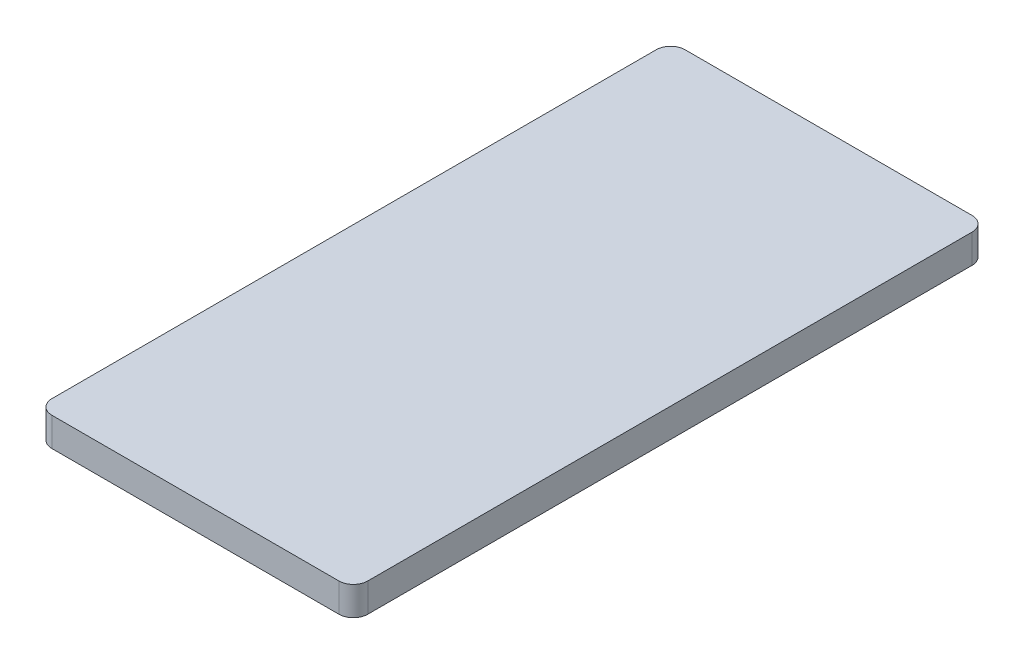
ISO-10303-21;
HEADER;
FILE_DESCRIPTION(('STEP AP214'),'2;1');
FILE_NAME('part.step','',(''),(''),'','','');
FILE_SCHEMA(('AUTOMOTIVE_DESIGN { 1 0 10303 214 1 1 1 1 }'));
ENDSEC;
DATA;
#1=APPLICATION_CONTEXT('core data for automotive mechanical design processes');
#2=APPLICATION_PROTOCOL_DEFINITION('international standard','automotive_design',2000,#1);
#3=PRODUCT_CONTEXT('',#1,'mechanical');
#4=PRODUCT('Part','Part','',(#3));
#5=PRODUCT_RELATED_PRODUCT_CATEGORY('part','',(#4));
#6=PRODUCT_DEFINITION_FORMATION('','',#4);
#7=PRODUCT_DEFINITION_CONTEXT('part definition',#1,'design');
#8=PRODUCT_DEFINITION('design','',#6,#7);
#9=PRODUCT_DEFINITION_SHAPE('','',#8);
#10=(LENGTH_UNIT() NAMED_UNIT(*) SI_UNIT(.MILLI.,.METRE.));
#11=(NAMED_UNIT(*) PLANE_ANGLE_UNIT() SI_UNIT($,.RADIAN.));
#12=(NAMED_UNIT(*) SI_UNIT($,.STERADIAN.) SOLID_ANGLE_UNIT());
#13=UNCERTAINTY_MEASURE_WITH_UNIT(LENGTH_MEASURE(1.E-05),#10,'distance_accuracy_value','');
#14=(GEOMETRIC_REPRESENTATION_CONTEXT(3) GLOBAL_UNCERTAINTY_ASSIGNED_CONTEXT((#13)) GLOBAL_UNIT_ASSIGNED_CONTEXT((#10,
#11,#12)) REPRESENTATION_CONTEXT('',''));
#15=CARTESIAN_POINT('',(0.,0.,0.));
#16=DIRECTION('',(0.,0.,1.));
#17=DIRECTION('',(1.,0.,0.));
#18=AXIS2_PLACEMENT_3D('',#15,#16,#17);
#19=CARTESIAN_POINT('',(-12.6365,2.54,26.6065));
#20=DIRECTION('',(0.,-1.,0.));
#21=DIRECTION('',(0.,0.,-1.));
#22=AXIS2_PLACEMENT_3D('',#19,#20,#21);
#23=CYLINDRICAL_SURFACE('',#22,1.27);
#24=CARTESIAN_POINT('',(-12.6365,0.,26.6065));
#25=DIRECTION('',(0.,1.,0.));
#26=DIRECTION('',(0.,0.,-1.));
#27=AXIS2_PLACEMENT_3D('',#24,#25,#26);
#28=CIRCLE('',#27,1.27);
#29=CARTESIAN_POINT('',(-13.9065,0.,26.6065));
#30=VERTEX_POINT('',#29);
#31=CARTESIAN_POINT('',(-12.6365,0.,27.8765));
#32=VERTEX_POINT('',#31);
#33=EDGE_CURVE('E139',#30,#32,#28,.T.);
#34=ORIENTED_EDGE('',*,*,#33,.T.);
#35=DIRECTION('',(0.,-1.,0.));
#36=VECTOR('',#35,1.);
#37=CARTESIAN_POINT('',(-12.6365,2.54,27.8765));
#38=LINE('',#37,#36);
#39=CARTESIAN_POINT('',(-12.6365,2.54,27.8765));
#40=VERTEX_POINT('',#39);
#41=EDGE_CURVE('E11',#40,#32,#38,.T.);
#42=ORIENTED_EDGE('',*,*,#41,.F.);
#43=CARTESIAN_POINT('',(-12.6365,2.54,26.6065));
#44=DIRECTION('',(0.,1.,0.));
#45=DIRECTION('',(0.,0.,-1.));
#46=AXIS2_PLACEMENT_3D('',#43,#44,#45);
#47=CIRCLE('',#46,1.27);
#48=CARTESIAN_POINT('',(-13.9065,2.54,26.6065));
#49=VERTEX_POINT('',#48);
#50=EDGE_CURVE('E153',#49,#40,#47,.T.);
#51=ORIENTED_EDGE('',*,*,#50,.F.);
#52=DIRECTION('',(0.,-1.,0.));
#53=VECTOR('',#52,1.);
#54=CARTESIAN_POINT('',(-13.9065,2.54,26.6065));
#55=LINE('',#54,#53);
#56=EDGE_CURVE('E135',#49,#30,#55,.T.);
#57=ORIENTED_EDGE('',*,*,#56,.T.);
#58=EDGE_LOOP('',(#34,#42,#51,#57));
#59=FACE_BOUND('',#58,.T.);
#60=ADVANCED_FACE('F43',(#59),#23,.T.);
#61=CARTESIAN_POINT('',(-12.6365,2.54,27.8765));
#62=DIRECTION('',(0.,0.,-1.));
#63=DIRECTION('',(-1.,0.,0.));
#64=AXIS2_PLACEMENT_3D('',#61,#62,#63);
#65=PLANE('',#64);
#66=DIRECTION('',(1.,0.,0.));
#67=VECTOR('',#66,1.);
#68=CARTESIAN_POINT('',(-12.6365,0.,27.8765));
#69=LINE('',#68,#67);
#70=CARTESIAN_POINT('',(12.6365,0.,27.8765));
#71=VERTEX_POINT('',#70);
#72=EDGE_CURVE('E142',#32,#71,#69,.T.);
#73=ORIENTED_EDGE('',*,*,#72,.T.);
#74=DIRECTION('',(0.,-1.,0.));
#75=VECTOR('',#74,1.);
#76=CARTESIAN_POINT('',(12.6365,2.54,27.8765));
#77=LINE('',#76,#75);
#78=CARTESIAN_POINT('',(12.6365,2.54,27.8765));
#79=VERTEX_POINT('',#78);
#80=EDGE_CURVE('E51',#79,#71,#77,.T.);
#81=ORIENTED_EDGE('',*,*,#80,.F.);
#82=DIRECTION('',(1.,0.,0.));
#83=VECTOR('',#82,1.);
#84=CARTESIAN_POINT('',(-12.6365,2.54,27.8765));
#85=LINE('',#84,#83);
#86=EDGE_CURVE('E102',#40,#79,#85,.T.);
#87=ORIENTED_EDGE('',*,*,#86,.F.);
#88=ORIENTED_EDGE('',*,*,#41,.T.);
#89=EDGE_LOOP('',(#73,#81,#87,#88));
#90=FACE_BOUND('',#89,.T.);
#91=ADVANCED_FACE('F188',(#90),#65,.F.);
#92=CARTESIAN_POINT('',(12.6365,2.54,26.6065));
#93=DIRECTION('',(0.,-1.,0.));
#94=DIRECTION('',(0.,0.,-1.));
#95=AXIS2_PLACEMENT_3D('',#92,#93,#94);
#96=CYLINDRICAL_SURFACE('',#95,1.27);
#97=CARTESIAN_POINT('',(12.6365,0.,26.6065));
#98=DIRECTION('',(0.,1.,0.));
#99=DIRECTION('',(0.,0.,1.));
#100=AXIS2_PLACEMENT_3D('',#97,#98,#99);
#101=CIRCLE('',#100,1.27);
#102=CARTESIAN_POINT('',(13.9065,0.,26.6065));
#103=VERTEX_POINT('',#102);
#104=EDGE_CURVE('E144',#71,#103,#101,.T.);
#105=ORIENTED_EDGE('',*,*,#104,.T.);
#106=DIRECTION('',(0.,-1.,0.));
#107=VECTOR('',#106,1.);
#108=CARTESIAN_POINT('',(13.9065,2.54,26.6065));
#109=LINE('',#108,#107);
#110=CARTESIAN_POINT('',(13.9065,2.54,26.6065));
#111=VERTEX_POINT('',#110);
#112=EDGE_CURVE('E160',#111,#103,#109,.T.);
#113=ORIENTED_EDGE('',*,*,#112,.F.);
#114=CARTESIAN_POINT('',(12.6365,2.54,26.6065));
#115=DIRECTION('',(0.,1.,0.));
#116=DIRECTION('',(0.,0.,1.));
#117=AXIS2_PLACEMENT_3D('',#114,#115,#116);
#118=CIRCLE('',#117,1.27);
#119=EDGE_CURVE('E168',#79,#111,#118,.T.);
#120=ORIENTED_EDGE('',*,*,#119,.F.);
#121=ORIENTED_EDGE('',*,*,#80,.T.);
#122=EDGE_LOOP('',(#105,#113,#120,#121));
#123=FACE_BOUND('',#122,.T.);
#124=ADVANCED_FACE('F166',(#123),#96,.T.);
#125=CARTESIAN_POINT('',(13.9065,2.54,26.6065));
#126=DIRECTION('',(-1.,0.,0.));
#127=DIRECTION('',(0.,0.,1.));
#128=AXIS2_PLACEMENT_3D('',#125,#126,#127);
#129=PLANE('',#128);
#130=DIRECTION('',(0.,0.,-1.));
#131=VECTOR('',#130,1.);
#132=CARTESIAN_POINT('',(13.9065,0.,26.6065));
#133=LINE('',#132,#131);
#134=CARTESIAN_POINT('',(13.9065,0.,-26.6065));
#135=VERTEX_POINT('',#134);
#136=EDGE_CURVE('E146',#103,#135,#133,.T.);
#137=ORIENTED_EDGE('',*,*,#136,.T.);
#138=DIRECTION('',(0.,-1.,0.));
#139=VECTOR('',#138,1.);
#140=CARTESIAN_POINT('',(13.9065,2.54,-26.6065));
#141=LINE('',#140,#139);
#142=CARTESIAN_POINT('',(13.9065,2.54,-26.6065));
#143=VERTEX_POINT('',#142);
#144=EDGE_CURVE('E157',#143,#135,#141,.T.);
#145=ORIENTED_EDGE('',*,*,#144,.F.);
#146=DIRECTION('',(0.,0.,-1.));
#147=VECTOR('',#146,1.);
#148=CARTESIAN_POINT('',(13.9065,2.54,26.6065));
#149=LINE('',#148,#147);
#150=EDGE_CURVE('E180',#111,#143,#149,.T.);
#151=ORIENTED_EDGE('',*,*,#150,.F.);
#152=ORIENTED_EDGE('',*,*,#112,.T.);
#153=EDGE_LOOP('',(#137,#145,#151,#152));
#154=FACE_BOUND('',#153,.T.);
#155=ADVANCED_FACE('F176',(#154),#129,.F.);
#156=CARTESIAN_POINT('',(12.6365,2.54,-26.6065));
#157=DIRECTION('',(0.,-1.,0.));
#158=DIRECTION('',(0.,0.,-1.));
#159=AXIS2_PLACEMENT_3D('',#156,#157,#158);
#160=CYLINDRICAL_SURFACE('',#159,1.27);
#161=CARTESIAN_POINT('',(12.6365,0.,-26.6065));
#162=DIRECTION('',(0.,1.,0.));
#163=DIRECTION('',(0.,0.,-1.));
#164=AXIS2_PLACEMENT_3D('',#161,#162,#163);
#165=CIRCLE('',#164,1.27);
#166=CARTESIAN_POINT('',(12.6365,0.,-27.8765));
#167=VERTEX_POINT('',#166);
#168=EDGE_CURVE('E148',#135,#167,#165,.T.);
#169=ORIENTED_EDGE('',*,*,#168,.T.);
#170=DIRECTION('',(0.,-1.,0.));
#171=VECTOR('',#170,1.);
#172=CARTESIAN_POINT('',(12.6365,2.54,-27.8765));
#173=LINE('',#172,#171);
#174=CARTESIAN_POINT('',(12.6365,2.54,-27.8765));
#175=VERTEX_POINT('',#174);
#176=EDGE_CURVE('E130',#175,#167,#173,.T.);
#177=ORIENTED_EDGE('',*,*,#176,.F.);
#178=CARTESIAN_POINT('',(12.6365,2.54,-26.6065));
#179=DIRECTION('',(0.,1.,0.));
#180=DIRECTION('',(0.,0.,-1.));
#181=AXIS2_PLACEMENT_3D('',#178,#179,#180);
#182=CIRCLE('',#181,1.27);
#183=EDGE_CURVE('E121',#143,#175,#182,.T.);
#184=ORIENTED_EDGE('',*,*,#183,.F.);
#185=ORIENTED_EDGE('',*,*,#144,.T.);
#186=EDGE_LOOP('',(#169,#177,#184,#185));
#187=FACE_BOUND('',#186,.T.);
#188=ADVANCED_FACE('F179',(#187),#160,.T.);
#189=CARTESIAN_POINT('',(-12.6365,2.54,-27.8765));
#190=DIRECTION('',(0.,0.,1.));
#191=DIRECTION('',(1.,0.,0.));
#192=AXIS2_PLACEMENT_3D('',#189,#190,#191);
#193=PLANE('',#192);
#194=DIRECTION('',(-1.,0.,0.));
#195=VECTOR('',#194,1.);
#196=CARTESIAN_POINT('',(-12.6365,0.,-27.8765));
#197=LINE('',#196,#195);
#198=CARTESIAN_POINT('',(-12.6365,0.,-27.8765));
#199=VERTEX_POINT('',#198);
#200=EDGE_CURVE('E129',#167,#199,#197,.T.);
#201=ORIENTED_EDGE('',*,*,#200,.T.);
#202=DIRECTION('',(0.,-1.,0.));
#203=VECTOR('',#202,1.);
#204=CARTESIAN_POINT('',(-12.6365,2.54,-27.8765));
#205=LINE('',#204,#203);
#206=CARTESIAN_POINT('',(-12.6365,2.54,-27.8765));
#207=VERTEX_POINT('',#206);
#208=EDGE_CURVE('E126',#207,#199,#205,.T.);
#209=ORIENTED_EDGE('',*,*,#208,.F.);
#210=DIRECTION('',(-1.,0.,0.));
#211=VECTOR('',#210,1.);
#212=CARTESIAN_POINT('',(-12.6365,2.54,-27.8765));
#213=LINE('',#212,#211);
#214=EDGE_CURVE('E115',#175,#207,#213,.T.);
#215=ORIENTED_EDGE('',*,*,#214,.F.);
#216=ORIENTED_EDGE('',*,*,#176,.T.);
#217=EDGE_LOOP('',(#201,#209,#215,#216));
#218=FACE_BOUND('',#217,.T.);
#219=ADVANCED_FACE('F127',(#218),#193,.F.);
#220=CARTESIAN_POINT('',(-12.6365,2.54,-26.6065));
#221=DIRECTION('',(0.,-1.,0.));
#222=DIRECTION('',(0.,0.,-1.));
#223=AXIS2_PLACEMENT_3D('',#220,#221,#222);
#224=CYLINDRICAL_SURFACE('',#223,1.27);
#225=CARTESIAN_POINT('',(-12.6365,0.,-26.6065));
#226=DIRECTION('',(0.,1.,0.));
#227=DIRECTION('',(0.,0.,-1.));
#228=AXIS2_PLACEMENT_3D('',#225,#226,#227);
#229=CIRCLE('',#228,1.27);
#230=CARTESIAN_POINT('',(-13.9065,0.,-26.6065));
#231=VERTEX_POINT('',#230);
#232=EDGE_CURVE('E88',#199,#231,#229,.T.);
#233=ORIENTED_EDGE('',*,*,#232,.T.);
#234=DIRECTION('',(0.,-1.,0.));
#235=VECTOR('',#234,1.);
#236=CARTESIAN_POINT('',(-13.9065,2.54,-26.6065));
#237=LINE('',#236,#235);
#238=CARTESIAN_POINT('',(-13.9065,2.54,-26.6065));
#239=VERTEX_POINT('',#238);
#240=EDGE_CURVE('E131',#239,#231,#237,.T.);
#241=ORIENTED_EDGE('',*,*,#240,.F.);
#242=CARTESIAN_POINT('',(-12.6365,2.54,-26.6065));
#243=DIRECTION('',(0.,1.,0.));
#244=DIRECTION('',(0.,0.,-1.));
#245=AXIS2_PLACEMENT_3D('',#242,#243,#244);
#246=CIRCLE('',#245,1.27);
#247=EDGE_CURVE('E119',#207,#239,#246,.T.);
#248=ORIENTED_EDGE('',*,*,#247,.F.);
#249=ORIENTED_EDGE('',*,*,#208,.T.);
#250=EDGE_LOOP('',(#233,#241,#248,#249));
#251=FACE_BOUND('',#250,.T.);
#252=ADVANCED_FACE('F133',(#251),#224,.T.);
#253=CARTESIAN_POINT('',(-13.9065,2.54,26.6065));
#254=DIRECTION('',(1.,0.,0.));
#255=DIRECTION('',(0.,0.,-1.));
#256=AXIS2_PLACEMENT_3D('',#253,#254,#255);
#257=PLANE('',#256);
#258=DIRECTION('',(0.,0.,1.));
#259=VECTOR('',#258,1.);
#260=CARTESIAN_POINT('',(-13.9065,0.,26.6065));
#261=LINE('',#260,#259);
#262=EDGE_CURVE('E94',#231,#30,#261,.T.);
#263=ORIENTED_EDGE('',*,*,#262,.T.);
#264=ORIENTED_EDGE('',*,*,#56,.F.);
#265=DIRECTION('',(0.,0.,1.));
#266=VECTOR('',#265,1.);
#267=CARTESIAN_POINT('',(-13.9065,2.54,26.6065));
#268=LINE('',#267,#266);
#269=EDGE_CURVE('E59',#239,#49,#268,.T.);
#270=ORIENTED_EDGE('',*,*,#269,.F.);
#271=ORIENTED_EDGE('',*,*,#240,.T.);
#272=EDGE_LOOP('',(#263,#264,#270,#271));
#273=FACE_BOUND('',#272,.T.);
#274=ADVANCED_FACE('F204',(#273),#257,.F.);
#275=CARTESIAN_POINT('',(-12.6365,2.54,26.6065));
#276=DIRECTION('',(0.,-1.,0.));
#277=DIRECTION('',(0.,0.,-1.));
#278=AXIS2_PLACEMENT_3D('',#275,#276,#277);
#279=PLANE('',#278);
#280=ORIENTED_EDGE('',*,*,#50,.T.);
#281=ORIENTED_EDGE('',*,*,#86,.T.);
#282=ORIENTED_EDGE('',*,*,#119,.T.);
#283=ORIENTED_EDGE('',*,*,#150,.T.);
#284=ORIENTED_EDGE('',*,*,#183,.T.);
#285=ORIENTED_EDGE('',*,*,#214,.T.);
#286=ORIENTED_EDGE('',*,*,#247,.T.);
#287=ORIENTED_EDGE('',*,*,#269,.T.);
#288=EDGE_LOOP('',(#280,#281,#282,#283,#284,#285,#286,#287));
#289=FACE_BOUND('',#288,.T.);
#290=ADVANCED_FACE('F117',(#289),#279,.F.);
#291=CARTESIAN_POINT('',(-12.6365,0.,26.6065));
#292=DIRECTION('',(0.,-1.,0.));
#293=DIRECTION('',(0.,0.,-1.));
#294=AXIS2_PLACEMENT_3D('',#291,#292,#293);
#295=PLANE('',#294);
#296=ORIENTED_EDGE('',*,*,#33,.F.);
#297=ORIENTED_EDGE('',*,*,#262,.F.);
#298=ORIENTED_EDGE('',*,*,#232,.F.);
#299=ORIENTED_EDGE('',*,*,#200,.F.);
#300=ORIENTED_EDGE('',*,*,#168,.F.);
#301=ORIENTED_EDGE('',*,*,#136,.F.);
#302=ORIENTED_EDGE('',*,*,#104,.F.);
#303=ORIENTED_EDGE('',*,*,#72,.F.);
#304=EDGE_LOOP('',(#296,#297,#298,#299,#300,#301,#302,#303));
#305=FACE_BOUND('',#304,.T.);
#306=ADVANCED_FACE('F172',(#305),#295,.T.);
#307=CLOSED_SHELL('',(#60,#91,#124,#155,#188,#219,#252,#274,#290,#306));
#308=MANIFOLD_SOLID_BREP('B2',#307);
#309=ADVANCED_BREP_SHAPE_REPRESENTATION('',(#18,#308),#14);
#310=SHAPE_DEFINITION_REPRESENTATION(#9,#309);
ENDSEC;
END-ISO-10303-21;
